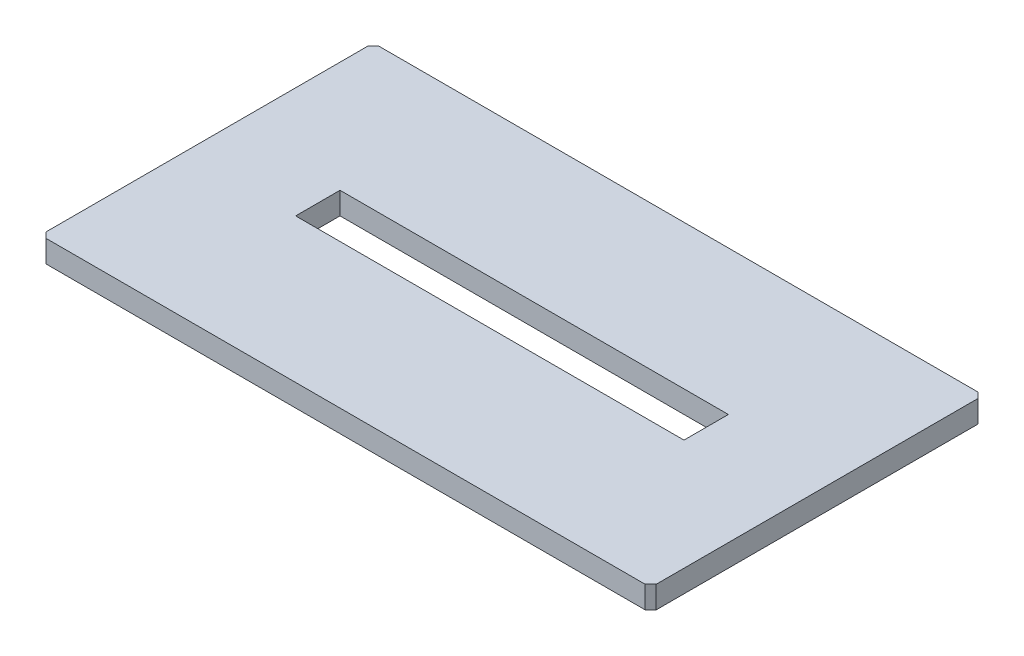
ISO-10303-21;
HEADER;
FILE_DESCRIPTION(('STEP AP214'),'2;1');
FILE_NAME('part.step','',(''),(''),'','','');
FILE_SCHEMA(('AUTOMOTIVE_DESIGN { 1 0 10303 214 1 1 1 1 }'));
ENDSEC;
DATA;
#1=APPLICATION_CONTEXT('core data for automotive mechanical design processes');
#2=APPLICATION_PROTOCOL_DEFINITION('international standard','automotive_design',2000,#1);
#3=PRODUCT_CONTEXT('',#1,'mechanical');
#4=PRODUCT('Part','Part','',(#3));
#5=PRODUCT_RELATED_PRODUCT_CATEGORY('part','',(#4));
#6=PRODUCT_DEFINITION_FORMATION('','',#4);
#7=PRODUCT_DEFINITION_CONTEXT('part definition',#1,'design');
#8=PRODUCT_DEFINITION('design','',#6,#7);
#9=PRODUCT_DEFINITION_SHAPE('','',#8);
#10=(LENGTH_UNIT() NAMED_UNIT(*) SI_UNIT(.MILLI.,.METRE.));
#11=(NAMED_UNIT(*) PLANE_ANGLE_UNIT() SI_UNIT($,.RADIAN.));
#12=(NAMED_UNIT(*) SI_UNIT($,.STERADIAN.) SOLID_ANGLE_UNIT());
#13=UNCERTAINTY_MEASURE_WITH_UNIT(LENGTH_MEASURE(1.E-05),#10,'distance_accuracy_value','');
#14=(GEOMETRIC_REPRESENTATION_CONTEXT(3) GLOBAL_UNCERTAINTY_ASSIGNED_CONTEXT((#13)) GLOBAL_UNIT_ASSIGNED_CONTEXT((#10,
#11,#12)) REPRESENTATION_CONTEXT('',''));
#15=CARTESIAN_POINT('',(0.,0.,0.));
#16=DIRECTION('',(0.,0.,1.));
#17=DIRECTION('',(1.,0.,0.));
#18=AXIS2_PLACEMENT_3D('',#15,#16,#17);
#19=CARTESIAN_POINT('',(275.,-20.,150.));
#20=DIRECTION('',(1.,0.,0.));
#21=DIRECTION('',(0.,0.,-1.));
#22=AXIS2_PLACEMENT_3D('',#19,#20,#21);
#23=PLANE('',#22);
#24=DIRECTION('',(0.,0.,-1.));
#25=VECTOR('',#24,1.);
#26=CARTESIAN_POINT('',(275.,-20.,150.));
#27=LINE('',#26,#25);
#28=CARTESIAN_POINT('',(275.,-20.,145.));
#29=VERTEX_POINT('',#28);
#30=CARTESIAN_POINT('',(275.,-20.,-145.));
#31=VERTEX_POINT('',#30);
#32=EDGE_CURVE('E199',#29,#31,#27,.T.);
#33=ORIENTED_EDGE('',*,*,#32,.T.);
#34=DIRECTION('',(0.,1.,0.));
#35=VECTOR('',#34,1.);
#36=CARTESIAN_POINT('',(275.,-20.,-145.));
#37=LINE('',#36,#35);
#38=CARTESIAN_POINT('',(275.,0.,-145.));
#39=VERTEX_POINT('',#38);
#40=EDGE_CURVE('E12',#31,#39,#37,.T.);
#41=ORIENTED_EDGE('',*,*,#40,.T.);
#42=DIRECTION('',(0.,0.,-1.));
#43=VECTOR('',#42,1.);
#44=CARTESIAN_POINT('',(275.,0.,150.));
#45=LINE('',#44,#43);
#46=CARTESIAN_POINT('',(275.,0.,145.));
#47=VERTEX_POINT('',#46);
#48=EDGE_CURVE('E193',#47,#39,#45,.T.);
#49=ORIENTED_EDGE('',*,*,#48,.F.);
#50=DIRECTION('',(0.,-1.,0.));
#51=VECTOR('',#50,1.);
#52=CARTESIAN_POINT('',(275.,-20.,145.));
#53=LINE('',#52,#51);
#54=EDGE_CURVE('E57',#47,#29,#53,.T.);
#55=ORIENTED_EDGE('',*,*,#54,.T.);
#56=EDGE_LOOP('',(#33,#41,#49,#55));
#57=FACE_BOUND('',#56,.T.);
#58=ADVANCED_FACE('F47',(#57),#23,.T.);
#59=CARTESIAN_POINT('',(-275.,-20.,150.));
#60=DIRECTION('',(0.,0.,1.));
#61=DIRECTION('',(1.,0.,0.));
#62=AXIS2_PLACEMENT_3D('',#59,#60,#61);
#63=PLANE('',#62);
#64=DIRECTION('',(1.,0.,0.));
#65=VECTOR('',#64,1.);
#66=CARTESIAN_POINT('',(-275.,0.,150.));
#67=LINE('',#66,#65);
#68=CARTESIAN_POINT('',(-270.,0.,150.));
#69=VERTEX_POINT('',#68);
#70=CARTESIAN_POINT('',(270.,0.,150.));
#71=VERTEX_POINT('',#70);
#72=EDGE_CURVE('E204',#69,#71,#67,.T.);
#73=ORIENTED_EDGE('',*,*,#72,.F.);
#74=DIRECTION('',(0.,-1.,0.));
#75=VECTOR('',#74,1.);
#76=CARTESIAN_POINT('',(-270.,-20.,150.));
#77=LINE('',#76,#75);
#78=CARTESIAN_POINT('',(-270.,-20.,150.));
#79=VERTEX_POINT('',#78);
#80=EDGE_CURVE('E71',#69,#79,#77,.T.);
#81=ORIENTED_EDGE('',*,*,#80,.T.);
#82=DIRECTION('',(1.,0.,0.));
#83=VECTOR('',#82,1.);
#84=CARTESIAN_POINT('',(-275.,-20.,150.));
#85=LINE('',#84,#83);
#86=CARTESIAN_POINT('',(270.,-20.,150.));
#87=VERTEX_POINT('',#86);
#88=EDGE_CURVE('E212',#79,#87,#85,.T.);
#89=ORIENTED_EDGE('',*,*,#88,.T.);
#90=DIRECTION('',(0.,1.,0.));
#91=VECTOR('',#90,1.);
#92=CARTESIAN_POINT('',(270.,-20.,150.));
#93=LINE('',#92,#91);
#94=EDGE_CURVE('E266',#87,#71,#93,.T.);
#95=ORIENTED_EDGE('',*,*,#94,.T.);
#96=EDGE_LOOP('',(#73,#81,#89,#95));
#97=FACE_BOUND('',#96,.T.);
#98=ADVANCED_FACE('F282',(#97),#63,.T.);
#99=CARTESIAN_POINT('',(-275.,-20.,150.));
#100=DIRECTION('',(-1.,0.,0.));
#101=DIRECTION('',(0.,0.,1.));
#102=AXIS2_PLACEMENT_3D('',#99,#100,#101);
#103=PLANE('',#102);
#104=DIRECTION('',(0.,0.,1.));
#105=VECTOR('',#104,1.);
#106=CARTESIAN_POINT('',(-275.,0.,150.));
#107=LINE('',#106,#105);
#108=CARTESIAN_POINT('',(-275.,0.,-145.));
#109=VERTEX_POINT('',#108);
#110=CARTESIAN_POINT('',(-275.,0.,145.));
#111=VERTEX_POINT('',#110);
#112=EDGE_CURVE('E223',#109,#111,#107,.T.);
#113=ORIENTED_EDGE('',*,*,#112,.F.);
#114=DIRECTION('',(0.,-1.,0.));
#115=VECTOR('',#114,1.);
#116=CARTESIAN_POINT('',(-275.,-20.,-145.));
#117=LINE('',#116,#115);
#118=CARTESIAN_POINT('',(-275.,-20.,-145.));
#119=VERTEX_POINT('',#118);
#120=EDGE_CURVE('E252',#109,#119,#117,.T.);
#121=ORIENTED_EDGE('',*,*,#120,.T.);
#122=DIRECTION('',(0.,0.,1.));
#123=VECTOR('',#122,1.);
#124=CARTESIAN_POINT('',(-275.,-20.,150.));
#125=LINE('',#124,#123);
#126=CARTESIAN_POINT('',(-275.,-20.,145.));
#127=VERTEX_POINT('',#126);
#128=EDGE_CURVE('E208',#119,#127,#125,.T.);
#129=ORIENTED_EDGE('',*,*,#128,.T.);
#130=DIRECTION('',(0.,1.,0.));
#131=VECTOR('',#130,1.);
#132=CARTESIAN_POINT('',(-275.,-20.,145.));
#133=LINE('',#132,#131);
#134=EDGE_CURVE('E248',#127,#111,#133,.T.);
#135=ORIENTED_EDGE('',*,*,#134,.T.);
#136=EDGE_LOOP('',(#113,#121,#129,#135));
#137=FACE_BOUND('',#136,.T.);
#138=ADVANCED_FACE('F291',(#137),#103,.T.);
#139=CARTESIAN_POINT('',(-275.,-20.,-150.));
#140=DIRECTION('',(0.,0.,-1.));
#141=DIRECTION('',(-1.,0.,0.));
#142=AXIS2_PLACEMENT_3D('',#139,#140,#141);
#143=PLANE('',#142);
#144=DIRECTION('',(-1.,0.,0.));
#145=VECTOR('',#144,1.);
#146=CARTESIAN_POINT('',(-275.,-20.,-150.));
#147=LINE('',#146,#145);
#148=CARTESIAN_POINT('',(270.,-20.,-150.));
#149=VERTEX_POINT('',#148);
#150=CARTESIAN_POINT('',(-270.,-20.,-150.));
#151=VERTEX_POINT('',#150);
#152=EDGE_CURVE('E203',#149,#151,#147,.T.);
#153=ORIENTED_EDGE('',*,*,#152,.T.);
#154=DIRECTION('',(0.,1.,0.));
#155=VECTOR('',#154,1.);
#156=CARTESIAN_POINT('',(-270.,-20.,-150.));
#157=LINE('',#156,#155);
#158=CARTESIAN_POINT('',(-270.,0.,-150.));
#159=VERTEX_POINT('',#158);
#160=EDGE_CURVE('E232',#151,#159,#157,.T.);
#161=ORIENTED_EDGE('',*,*,#160,.T.);
#162=DIRECTION('',(-1.,0.,0.));
#163=VECTOR('',#162,1.);
#164=CARTESIAN_POINT('',(-275.,0.,-150.));
#165=LINE('',#164,#163);
#166=CARTESIAN_POINT('',(270.,0.,-150.));
#167=VERTEX_POINT('',#166);
#168=EDGE_CURVE('E219',#167,#159,#165,.T.);
#169=ORIENTED_EDGE('',*,*,#168,.F.);
#170=DIRECTION('',(0.,-1.,0.));
#171=VECTOR('',#170,1.);
#172=CARTESIAN_POINT('',(270.,-20.,-150.));
#173=LINE('',#172,#171);
#174=EDGE_CURVE('E215',#167,#149,#173,.T.);
#175=ORIENTED_EDGE('',*,*,#174,.T.);
#176=EDGE_LOOP('',(#153,#161,#169,#175));
#177=FACE_BOUND('',#176,.T.);
#178=ADVANCED_FACE('F299',(#177),#143,.T.);
#179=CARTESIAN_POINT('',(0.,-20.,0.));
#180=DIRECTION('',(0.,-1.,0.));
#181=DIRECTION('',(0.,0.,-1.));
#182=AXIS2_PLACEMENT_3D('',#179,#180,#181);
#183=PLANE('',#182);
#184=CARTESIAN_POINT('',(-240.,-20.,-115.));
#185=DIRECTION('',(0.,1.,0.));
#186=DIRECTION('',(0.,0.,1.));
#187=AXIS2_PLACEMENT_3D('',#184,#185,#186);
#188=CIRCLE('',#187,5.00000000000002);
#189=CARTESIAN_POINT('',(-240.,-20.,-110.));
#190=VERTEX_POINT('',#189);
#191=EDGE_CURVE('E583',#190,#190,#188,.T.);
#192=ORIENTED_EDGE('',*,*,#191,.T.);
#193=EDGE_LOOP('',(#192));
#194=FACE_BOUND('',#193,.T.);
#195=CARTESIAN_POINT('',(240.,-20.,-115.));
#196=DIRECTION('',(0.,1.,0.));
#197=DIRECTION('',(0.,0.,1.));
#198=AXIS2_PLACEMENT_3D('',#195,#196,#197);
#199=CIRCLE('',#198,5.00000000000002);
#200=CARTESIAN_POINT('',(240.,-20.,-110.));
#201=VERTEX_POINT('',#200);
#202=EDGE_CURVE('E582',#201,#201,#199,.T.);
#203=ORIENTED_EDGE('',*,*,#202,.T.);
#204=EDGE_LOOP('',(#203));
#205=FACE_BOUND('',#204,.T.);
#206=CARTESIAN_POINT('',(240.,-20.,115.));
#207=DIRECTION('',(0.,1.,0.));
#208=DIRECTION('',(0.,0.,1.));
#209=AXIS2_PLACEMENT_3D('',#206,#207,#208);
#210=CIRCLE('',#209,5.00000000000002);
#211=CARTESIAN_POINT('',(240.,-20.,120.));
#212=VERTEX_POINT('',#211);
#213=EDGE_CURVE('E605',#212,#212,#210,.T.);
#214=ORIENTED_EDGE('',*,*,#213,.T.);
#215=EDGE_LOOP('',(#214));
#216=FACE_BOUND('',#215,.T.);
#217=CARTESIAN_POINT('',(-240.,-20.,115.));
#218=DIRECTION('',(0.,1.,0.));
#219=DIRECTION('',(0.,0.,1.));
#220=AXIS2_PLACEMENT_3D('',#217,#218,#219);
#221=CIRCLE('',#220,5.00000000000002);
#222=CARTESIAN_POINT('',(-240.,-20.,120.));
#223=VERTEX_POINT('',#222);
#224=EDGE_CURVE('E594',#223,#223,#221,.T.);
#225=ORIENTED_EDGE('',*,*,#224,.T.);
#226=EDGE_LOOP('',(#225));
#227=FACE_BOUND('',#226,.T.);
#228=DIRECTION('',(0.,0.,-1.));
#229=VECTOR('',#228,1.);
#230=CARTESIAN_POINT('',(175.,-20.,20.));
#231=LINE('',#230,#229);
#232=CARTESIAN_POINT('',(175.,-20.,20.));
#233=VERTEX_POINT('',#232);
#234=CARTESIAN_POINT('',(175.,-20.,-20.));
#235=VERTEX_POINT('',#234);
#236=EDGE_CURVE('E144',#233,#235,#231,.T.);
#237=ORIENTED_EDGE('',*,*,#236,.T.);
#238=DIRECTION('',(-1.,0.,0.));
#239=VECTOR('',#238,1.);
#240=CARTESIAN_POINT('',(-175.,-20.,-19.9999999999999));
#241=LINE('',#240,#239);
#242=CARTESIAN_POINT('',(-175.,-20.,-19.9999999999999));
#243=VERTEX_POINT('',#242);
#244=EDGE_CURVE('E157',#235,#243,#241,.T.);
#245=ORIENTED_EDGE('',*,*,#244,.T.);
#246=DIRECTION('',(0.,0.,1.));
#247=VECTOR('',#246,1.);
#248=CARTESIAN_POINT('',(-175.,-20.,20.));
#249=LINE('',#248,#247);
#250=CARTESIAN_POINT('',(-175.,-20.,20.));
#251=VERTEX_POINT('',#250);
#252=EDGE_CURVE('E162',#243,#251,#249,.T.);
#253=ORIENTED_EDGE('',*,*,#252,.T.);
#254=DIRECTION('',(1.,0.,0.));
#255=VECTOR('',#254,1.);
#256=CARTESIAN_POINT('',(-175.,-20.,20.));
#257=LINE('',#256,#255);
#258=EDGE_CURVE('E153',#251,#233,#257,.T.);
#259=ORIENTED_EDGE('',*,*,#258,.T.);
#260=EDGE_LOOP('',(#237,#245,#253,#259));
#261=FACE_BOUND('',#260,.T.);
#262=ORIENTED_EDGE('',*,*,#128,.F.);
#263=DIRECTION('',(-0.707106781186548,0.,0.707106781186548));
#264=VECTOR('',#263,1.);
#265=CARTESIAN_POINT('',(-210.,-20.,-210.));
#266=LINE('',#265,#264);
#267=EDGE_CURVE('E263',#119,#151,#266,.F.);
#268=ORIENTED_EDGE('',*,*,#267,.T.);
#269=ORIENTED_EDGE('',*,*,#152,.F.);
#270=DIRECTION('',(-0.707106781186548,0.,-0.707106781186548));
#271=VECTOR('',#270,1.);
#272=CARTESIAN_POINT('',(210.,-20.,-210.));
#273=LINE('',#272,#271);
#274=EDGE_CURVE('E257',#149,#31,#273,.F.);
#275=ORIENTED_EDGE('',*,*,#274,.T.);
#276=ORIENTED_EDGE('',*,*,#32,.F.);
#277=DIRECTION('',(0.707106781186548,0.,-0.707106781186548));
#278=VECTOR('',#277,1.);
#279=CARTESIAN_POINT('',(210.,-20.,210.));
#280=LINE('',#279,#278);
#281=EDGE_CURVE('E64',#29,#87,#280,.F.);
#282=ORIENTED_EDGE('',*,*,#281,.T.);
#283=ORIENTED_EDGE('',*,*,#88,.F.);
#284=DIRECTION('',(0.707106781186551,0.,0.707106781186544));
#285=VECTOR('',#284,1.);
#286=CARTESIAN_POINT('',(-209.999999999998,-20.,210.000000000001));
#287=LINE('',#286,#285);
#288=EDGE_CURVE('E260',#79,#127,#287,.F.);
#289=ORIENTED_EDGE('',*,*,#288,.T.);
#290=EDGE_LOOP('',(#262,#268,#269,#275,#276,#282,#283,#289));
#291=FACE_BOUND('',#290,.T.);
#292=ADVANCED_FACE('F164',(#194,#205,#216,#227,#261,#291),#183,.T.);
#293=CARTESIAN_POINT('',(0.,0.,0.));
#294=DIRECTION('',(0.,-1.,0.));
#295=DIRECTION('',(0.,0.,-1.));
#296=AXIS2_PLACEMENT_3D('',#293,#294,#295);
#297=PLANE('',#296);
#298=DIRECTION('',(-1.,0.,0.));
#299=VECTOR('',#298,1.);
#300=CARTESIAN_POINT('',(-175.,0.,-19.9999999999999));
#301=LINE('',#300,#299);
#302=CARTESIAN_POINT('',(175.,0.,-20.));
#303=VERTEX_POINT('',#302);
#304=CARTESIAN_POINT('',(-175.,0.,-19.9999999999999));
#305=VERTEX_POINT('',#304);
#306=EDGE_CURVE('E184',#303,#305,#301,.T.);
#307=ORIENTED_EDGE('',*,*,#306,.F.);
#308=DIRECTION('',(0.,0.,-1.));
#309=VECTOR('',#308,1.);
#310=CARTESIAN_POINT('',(175.,0.,20.));
#311=LINE('',#310,#309);
#312=CARTESIAN_POINT('',(175.,0.,20.));
#313=VERTEX_POINT('',#312);
#314=EDGE_CURVE('E147',#313,#303,#311,.T.);
#315=ORIENTED_EDGE('',*,*,#314,.F.);
#316=DIRECTION('',(1.,0.,0.));
#317=VECTOR('',#316,1.);
#318=CARTESIAN_POINT('',(-175.,0.,20.));
#319=LINE('',#318,#317);
#320=CARTESIAN_POINT('',(-175.,0.,20.));
#321=VERTEX_POINT('',#320);
#322=EDGE_CURVE('E167',#321,#313,#319,.T.);
#323=ORIENTED_EDGE('',*,*,#322,.F.);
#324=DIRECTION('',(0.,0.,1.));
#325=VECTOR('',#324,1.);
#326=CARTESIAN_POINT('',(-175.,0.,20.));
#327=LINE('',#326,#325);
#328=EDGE_CURVE('E172',#305,#321,#327,.T.);
#329=ORIENTED_EDGE('',*,*,#328,.F.);
#330=EDGE_LOOP('',(#307,#315,#323,#329));
#331=FACE_BOUND('',#330,.T.);
#332=ORIENTED_EDGE('',*,*,#168,.T.);
#333=DIRECTION('',(0.707106781186548,0.,-0.707106781186548));
#334=VECTOR('',#333,1.);
#335=CARTESIAN_POINT('',(-270.,0.,-150.));
#336=LINE('',#335,#334);
#337=EDGE_CURVE('E245',#159,#109,#336,.F.);
#338=ORIENTED_EDGE('',*,*,#337,.T.);
#339=ORIENTED_EDGE('',*,*,#112,.T.);
#340=DIRECTION('',(-0.707106781186551,0.,-0.707106781186544));
#341=VECTOR('',#340,1.);
#342=CARTESIAN_POINT('',(-275.,0.,145.));
#343=LINE('',#342,#341);
#344=EDGE_CURVE('E242',#111,#69,#343,.F.);
#345=ORIENTED_EDGE('',*,*,#344,.T.);
#346=ORIENTED_EDGE('',*,*,#72,.T.);
#347=DIRECTION('',(-0.707106781186548,0.,0.707106781186548));
#348=VECTOR('',#347,1.);
#349=CARTESIAN_POINT('',(270.,0.,150.));
#350=LINE('',#349,#348);
#351=EDGE_CURVE('E236',#71,#47,#350,.F.);
#352=ORIENTED_EDGE('',*,*,#351,.T.);
#353=ORIENTED_EDGE('',*,*,#48,.T.);
#354=DIRECTION('',(0.707106781186548,0.,0.707106781186548));
#355=VECTOR('',#354,1.);
#356=CARTESIAN_POINT('',(275.,0.,-145.));
#357=LINE('',#356,#355);
#358=EDGE_CURVE('E239',#39,#167,#357,.F.);
#359=ORIENTED_EDGE('',*,*,#358,.T.);
#360=EDGE_LOOP('',(#332,#338,#339,#345,#346,#352,#353,#359));
#361=FACE_BOUND('',#360,.T.);
#362=ADVANCED_FACE('F284',(#331,#361),#297,.F.);
#363=CARTESIAN_POINT('',(175.,-20.,20.));
#364=DIRECTION('',(1.,0.,0.));
#365=DIRECTION('',(0.,0.,-1.));
#366=AXIS2_PLACEMENT_3D('',#363,#364,#365);
#367=PLANE('',#366);
#368=ORIENTED_EDGE('',*,*,#314,.T.);
#369=DIRECTION('',(0.,1.,0.));
#370=VECTOR('',#369,1.);
#371=CARTESIAN_POINT('',(175.,-20.,-20.));
#372=LINE('',#371,#370);
#373=EDGE_CURVE('E140',#235,#303,#372,.T.);
#374=ORIENTED_EDGE('',*,*,#373,.F.);
#375=ORIENTED_EDGE('',*,*,#236,.F.);
#376=DIRECTION('',(0.,1.,0.));
#377=VECTOR('',#376,1.);
#378=CARTESIAN_POINT('',(175.,-20.,20.));
#379=LINE('',#378,#377);
#380=EDGE_CURVE('E190',#233,#313,#379,.T.);
#381=ORIENTED_EDGE('',*,*,#380,.T.);
#382=EDGE_LOOP('',(#368,#374,#375,#381));
#383=FACE_BOUND('',#382,.T.);
#384=ADVANCED_FACE('F142',(#383),#367,.F.);
#385=CARTESIAN_POINT('',(-175.,-20.,20.));
#386=DIRECTION('',(0.,0.,1.));
#387=DIRECTION('',(1.,0.,0.));
#388=AXIS2_PLACEMENT_3D('',#385,#386,#387);
#389=PLANE('',#388);
#390=ORIENTED_EDGE('',*,*,#322,.T.);
#391=ORIENTED_EDGE('',*,*,#380,.F.);
#392=ORIENTED_EDGE('',*,*,#258,.F.);
#393=DIRECTION('',(0.,1.,0.));
#394=VECTOR('',#393,1.);
#395=CARTESIAN_POINT('',(-175.,-20.,20.));
#396=LINE('',#395,#394);
#397=EDGE_CURVE('E194',#251,#321,#396,.T.);
#398=ORIENTED_EDGE('',*,*,#397,.T.);
#399=EDGE_LOOP('',(#390,#391,#392,#398));
#400=FACE_BOUND('',#399,.T.);
#401=ADVANCED_FACE('F339',(#400),#389,.F.);
#402=CARTESIAN_POINT('',(-175.,-20.,20.));
#403=DIRECTION('',(-1.,0.,0.));
#404=DIRECTION('',(0.,0.,1.));
#405=AXIS2_PLACEMENT_3D('',#402,#403,#404);
#406=PLANE('',#405);
#407=ORIENTED_EDGE('',*,*,#328,.T.);
#408=ORIENTED_EDGE('',*,*,#397,.F.);
#409=ORIENTED_EDGE('',*,*,#252,.F.);
#410=DIRECTION('',(0.,1.,0.));
#411=VECTOR('',#410,1.);
#412=CARTESIAN_POINT('',(-175.,-20.,-19.9999999999999));
#413=LINE('',#412,#411);
#414=EDGE_CURVE('E152',#243,#305,#413,.T.);
#415=ORIENTED_EDGE('',*,*,#414,.T.);
#416=EDGE_LOOP('',(#407,#408,#409,#415));
#417=FACE_BOUND('',#416,.T.);
#418=ADVANCED_FACE('F334',(#417),#406,.F.);
#419=CARTESIAN_POINT('',(-175.,-20.,-19.9999999999999));
#420=DIRECTION('',(0.,0.,-1.));
#421=DIRECTION('',(-1.,0.,0.));
#422=AXIS2_PLACEMENT_3D('',#419,#420,#421);
#423=PLANE('',#422);
#424=ORIENTED_EDGE('',*,*,#306,.T.);
#425=ORIENTED_EDGE('',*,*,#414,.F.);
#426=ORIENTED_EDGE('',*,*,#244,.F.);
#427=ORIENTED_EDGE('',*,*,#373,.T.);
#428=EDGE_LOOP('',(#424,#425,#426,#427));
#429=FACE_BOUND('',#428,.T.);
#430=ADVANCED_FACE('F158',(#429),#423,.F.);
#431=CARTESIAN_POINT('',(-270.,-20.,-150.));
#432=DIRECTION('',(0.707106781186547,0.,0.707106781186547));
#433=DIRECTION('',(0.,1.,0.));
#434=AXIS2_PLACEMENT_3D('',#431,#432,#433);
#435=PLANE('',#434);
#436=ORIENTED_EDGE('',*,*,#267,.F.);
#437=ORIENTED_EDGE('',*,*,#120,.F.);
#438=ORIENTED_EDGE('',*,*,#337,.F.);
#439=ORIENTED_EDGE('',*,*,#160,.F.);
#440=EDGE_LOOP('',(#436,#437,#438,#439));
#441=FACE_BOUND('',#440,.T.);
#442=ADVANCED_FACE('F296',(#441),#435,.F.);
#443=CARTESIAN_POINT('',(-275.,-20.,145.));
#444=DIRECTION('',(0.707106781186544,0.,-0.707106781186551));
#445=DIRECTION('',(0.,1.,0.));
#446=AXIS2_PLACEMENT_3D('',#443,#444,#445);
#447=PLANE('',#446);
#448=ORIENTED_EDGE('',*,*,#288,.F.);
#449=ORIENTED_EDGE('',*,*,#80,.F.);
#450=ORIENTED_EDGE('',*,*,#344,.F.);
#451=ORIENTED_EDGE('',*,*,#134,.F.);
#452=EDGE_LOOP('',(#448,#449,#450,#451));
#453=FACE_BOUND('',#452,.T.);
#454=ADVANCED_FACE('F289',(#453),#447,.F.);
#455=CARTESIAN_POINT('',(275.,-20.,-145.));
#456=DIRECTION('',(-0.707106781186548,0.,0.707106781186548));
#457=DIRECTION('',(0.,1.,0.));
#458=AXIS2_PLACEMENT_3D('',#455,#456,#457);
#459=PLANE('',#458);
#460=ORIENTED_EDGE('',*,*,#274,.F.);
#461=ORIENTED_EDGE('',*,*,#174,.F.);
#462=ORIENTED_EDGE('',*,*,#358,.F.);
#463=ORIENTED_EDGE('',*,*,#40,.F.);
#464=EDGE_LOOP('',(#460,#461,#462,#463));
#465=FACE_BOUND('',#464,.T.);
#466=ADVANCED_FACE('F302',(#465),#459,.F.);
#467=CARTESIAN_POINT('',(270.,-20.,150.));
#468=DIRECTION('',(-0.707106781186548,0.,-0.707106781186548));
#469=DIRECTION('',(0.,1.,0.));
#470=AXIS2_PLACEMENT_3D('',#467,#468,#469);
#471=PLANE('',#470);
#472=ORIENTED_EDGE('',*,*,#281,.F.);
#473=ORIENTED_EDGE('',*,*,#54,.F.);
#474=ORIENTED_EDGE('',*,*,#351,.F.);
#475=ORIENTED_EDGE('',*,*,#94,.F.);
#476=EDGE_LOOP('',(#472,#473,#474,#475));
#477=FACE_BOUND('',#476,.T.);
#478=ADVANCED_FACE('F50',(#477),#471,.F.);
#479=CARTESIAN_POINT('',(-240.,14.142135623731,115.));
#480=DIRECTION('',(0.,-1.,0.));
#481=DIRECTION('',(0.,0.,-1.));
#482=AXIS2_PLACEMENT_3D('',#479,#480,#481);
#483=CYLINDRICAL_SURFACE('',#482,5.00000000000002);
#484=CARTESIAN_POINT('',(-240.,-3.,115.));
#485=DIRECTION('',(0.,-1.,0.));
#486=DIRECTION('',(0.,0.,-1.));
#487=AXIS2_PLACEMENT_3D('',#484,#485,#486);
#488=CIRCLE('',#487,5.00000000000002);
#489=CARTESIAN_POINT('',(-240.,-3.,110.));
#490=VERTEX_POINT('',#489);
#491=EDGE_CURVE('E175',#490,#490,#488,.T.);
#492=ORIENTED_EDGE('',*,*,#491,.F.);
#493=EDGE_LOOP('',(#492));
#494=FACE_BOUND('',#493,.T.);
#495=ORIENTED_EDGE('',*,*,#224,.F.);
#496=EDGE_LOOP('',(#495));
#497=FACE_BOUND('',#496,.T.);
#498=ADVANCED_FACE('F308',(#494,#497),#483,.F.);
#499=CARTESIAN_POINT('',(0.,-3.,0.));
#500=DIRECTION('',(0.,-1.,0.));
#501=DIRECTION('',(0.,0.,-1.));
#502=AXIS2_PLACEMENT_3D('',#499,#500,#501);
#503=PLANE('',#502);
#504=ORIENTED_EDGE('',*,*,#491,.T.);
#505=EDGE_LOOP('',(#504));
#506=FACE_BOUND('',#505,.T.);
#507=ADVANCED_FACE('F414',(#506),#503,.T.);
#508=CARTESIAN_POINT('',(240.,14.142135623731,115.));
#509=DIRECTION('',(0.,-1.,0.));
#510=DIRECTION('',(0.,0.,-1.));
#511=AXIS2_PLACEMENT_3D('',#508,#509,#510);
#512=CYLINDRICAL_SURFACE('',#511,5.00000000000002);
#513=CARTESIAN_POINT('',(240.,-3.,115.));
#514=DIRECTION('',(0.,-1.,0.));
#515=DIRECTION('',(0.,0.,-1.));
#516=AXIS2_PLACEMENT_3D('',#513,#514,#515);
#517=CIRCLE('',#516,5.00000000000002);
#518=CARTESIAN_POINT('',(240.,-3.,110.));
#519=VERTEX_POINT('',#518);
#520=EDGE_CURVE('E597',#519,#519,#517,.T.);
#521=ORIENTED_EDGE('',*,*,#520,.F.);
#522=EDGE_LOOP('',(#521));
#523=FACE_BOUND('',#522,.T.);
#524=ORIENTED_EDGE('',*,*,#213,.F.);
#525=EDGE_LOOP('',(#524));
#526=FACE_BOUND('',#525,.T.);
#527=ADVANCED_FACE('F425',(#523,#526),#512,.F.);
#528=CARTESIAN_POINT('',(0.,-3.,0.));
#529=DIRECTION('',(0.,-1.,0.));
#530=DIRECTION('',(0.,0.,-1.));
#531=AXIS2_PLACEMENT_3D('',#528,#529,#530);
#532=PLANE('',#531);
#533=ORIENTED_EDGE('',*,*,#520,.T.);
#534=EDGE_LOOP('',(#533));
#535=FACE_BOUND('',#534,.T.);
#536=ADVANCED_FACE('F437',(#535),#532,.T.);
#537=CARTESIAN_POINT('',(240.,14.142135623731,-115.));
#538=DIRECTION('',(0.,-1.,0.));
#539=DIRECTION('',(0.,0.,-1.));
#540=AXIS2_PLACEMENT_3D('',#537,#538,#539);
#541=CYLINDRICAL_SURFACE('',#540,5.00000000000002);
#542=CARTESIAN_POINT('',(240.,-3.,-115.));
#543=DIRECTION('',(0.,-1.,0.));
#544=DIRECTION('',(0.,0.,-1.));
#545=AXIS2_PLACEMENT_3D('',#542,#543,#544);
#546=CIRCLE('',#545,5.00000000000002);
#547=CARTESIAN_POINT('',(240.,-3.,-120.));
#548=VERTEX_POINT('',#547);
#549=EDGE_CURVE('E589',#548,#548,#546,.T.);
#550=ORIENTED_EDGE('',*,*,#549,.F.);
#551=EDGE_LOOP('',(#550));
#552=FACE_BOUND('',#551,.T.);
#553=ORIENTED_EDGE('',*,*,#202,.F.);
#554=EDGE_LOOP('',(#553));
#555=FACE_BOUND('',#554,.T.);
#556=ADVANCED_FACE('F448',(#552,#555),#541,.F.);
#557=CARTESIAN_POINT('',(0.,-3.,0.));
#558=DIRECTION('',(0.,-1.,0.));
#559=DIRECTION('',(0.,0.,-1.));
#560=AXIS2_PLACEMENT_3D('',#557,#558,#559);
#561=PLANE('',#560);
#562=ORIENTED_EDGE('',*,*,#549,.T.);
#563=EDGE_LOOP('',(#562));
#564=FACE_BOUND('',#563,.T.);
#565=ADVANCED_FACE('F458',(#564),#561,.T.);
#566=CARTESIAN_POINT('',(-240.,14.142135623731,-115.));
#567=DIRECTION('',(0.,-1.,0.));
#568=DIRECTION('',(0.,0.,-1.));
#569=AXIS2_PLACEMENT_3D('',#566,#567,#568);
#570=CYLINDRICAL_SURFACE('',#569,5.00000000000002);
#571=CARTESIAN_POINT('',(-240.,-3.,-115.));
#572=DIRECTION('',(0.,-1.,0.));
#573=DIRECTION('',(0.,0.,-1.));
#574=AXIS2_PLACEMENT_3D('',#571,#572,#573);
#575=CIRCLE('',#574,5.00000000000002);
#576=CARTESIAN_POINT('',(-240.,-3.,-120.));
#577=VERTEX_POINT('',#576);
#578=EDGE_CURVE('E580',#577,#577,#575,.T.);
#579=ORIENTED_EDGE('',*,*,#578,.F.);
#580=EDGE_LOOP('',(#579));
#581=FACE_BOUND('',#580,.T.);
#582=ORIENTED_EDGE('',*,*,#191,.F.);
#583=EDGE_LOOP('',(#582));
#584=FACE_BOUND('',#583,.T.);
#585=ADVANCED_FACE('F468',(#581,#584),#570,.F.);
#586=CARTESIAN_POINT('',(0.,-3.,0.));
#587=DIRECTION('',(0.,-1.,0.));
#588=DIRECTION('',(0.,0.,-1.));
#589=AXIS2_PLACEMENT_3D('',#586,#587,#588);
#590=PLANE('',#589);
#591=ORIENTED_EDGE('',*,*,#578,.T.);
#592=EDGE_LOOP('',(#591));
#593=FACE_BOUND('',#592,.T.);
#594=ADVANCED_FACE('F478',(#593),#590,.T.);
#595=CLOSED_SHELL('',(#58,#98,#138,#178,#292,#362,#384,#401,#418,#430,#442,#454,#466,#478,#498,
#507,#527,#536,#556,#565,#585,#594));
#596=MANIFOLD_SOLID_BREP('B2',#595);
#597=ADVANCED_BREP_SHAPE_REPRESENTATION('',(#18,#596),#14);
#598=SHAPE_DEFINITION_REPRESENTATION(#9,#597);
ENDSEC;
END-ISO-10303-21;
